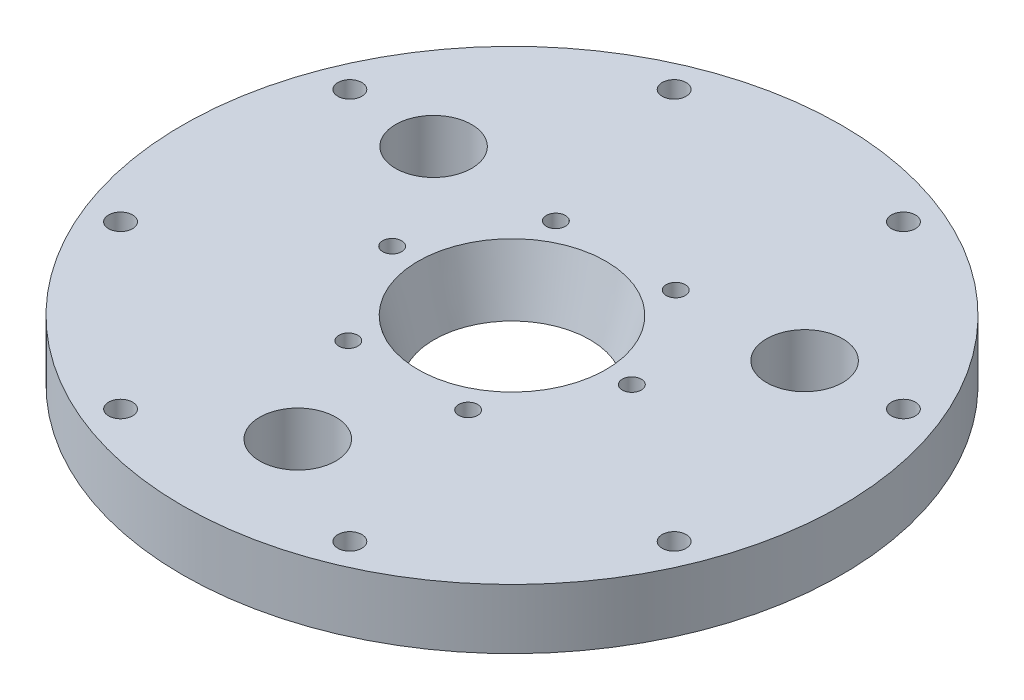
ISO-10303-21;
HEADER;
FILE_DESCRIPTION(('STEP AP214'),'2;1');
FILE_NAME('part.step','',(''),(''),'','','');
FILE_SCHEMA(('AUTOMOTIVE_DESIGN { 1 0 10303 214 1 1 1 1 }'));
ENDSEC;
DATA;
#1=APPLICATION_CONTEXT('core data for automotive mechanical design processes');
#2=APPLICATION_PROTOCOL_DEFINITION('international standard','automotive_design',2000,#1);
#3=PRODUCT_CONTEXT('',#1,'mechanical');
#4=PRODUCT('Part','Part','',(#3));
#5=PRODUCT_RELATED_PRODUCT_CATEGORY('part','',(#4));
#6=PRODUCT_DEFINITION_FORMATION('','',#4);
#7=PRODUCT_DEFINITION_CONTEXT('part definition',#1,'design');
#8=PRODUCT_DEFINITION('design','',#6,#7);
#9=PRODUCT_DEFINITION_SHAPE('','',#8);
#10=(LENGTH_UNIT() NAMED_UNIT(*) SI_UNIT(.MILLI.,.METRE.));
#11=(NAMED_UNIT(*) PLANE_ANGLE_UNIT() SI_UNIT($,.RADIAN.));
#12=(NAMED_UNIT(*) SI_UNIT($,.STERADIAN.) SOLID_ANGLE_UNIT());
#13=UNCERTAINTY_MEASURE_WITH_UNIT(LENGTH_MEASURE(1.E-05),#10,'distance_accuracy_value','');
#14=(GEOMETRIC_REPRESENTATION_CONTEXT(3) GLOBAL_UNCERTAINTY_ASSIGNED_CONTEXT((#13)) GLOBAL_UNIT_ASSIGNED_CONTEXT((#10,
#11,#12)) REPRESENTATION_CONTEXT('',''));
#15=CARTESIAN_POINT('',(0.,0.,0.));
#16=DIRECTION('',(0.,0.,1.));
#17=DIRECTION('',(1.,0.,0.));
#18=AXIS2_PLACEMENT_3D('',#15,#16,#17);
#19=CARTESIAN_POINT('',(0.,10.,0.));
#20=DIRECTION('',(0.,-1.,0.));
#21=DIRECTION('',(0.,0.,-1.));
#22=AXIS2_PLACEMENT_3D('',#19,#20,#21);
#23=CYLINDRICAL_SURFACE('',#22,55.);
#24=CARTESIAN_POINT('',(0.,10.,0.));
#25=DIRECTION('',(0.,1.,0.));
#26=DIRECTION('',(0.,0.,1.));
#27=AXIS2_PLACEMENT_3D('',#24,#25,#26);
#28=CIRCLE('',#27,55.);
#29=CARTESIAN_POINT('',(0.,10.,55.));
#30=VERTEX_POINT('',#29);
#31=EDGE_CURVE('E10',#30,#30,#28,.T.);
#32=ORIENTED_EDGE('',*,*,#31,.F.);
#33=EDGE_LOOP('',(#32));
#34=FACE_BOUND('',#33,.T.);
#35=CARTESIAN_POINT('',(0.,0.,0.));
#36=DIRECTION('',(0.,1.,0.));
#37=DIRECTION('',(0.,0.,1.));
#38=AXIS2_PLACEMENT_3D('',#35,#36,#37);
#39=CIRCLE('',#38,55.);
#40=CARTESIAN_POINT('',(0.,0.,55.));
#41=VERTEX_POINT('',#40);
#42=EDGE_CURVE('E37',#41,#41,#39,.T.);
#43=ORIENTED_EDGE('',*,*,#42,.T.);
#44=EDGE_LOOP('',(#43));
#45=FACE_BOUND('',#44,.T.);
#46=ADVANCED_FACE('F34',(#34,#45),#23,.T.);
#47=CARTESIAN_POINT('',(0.,10.,0.));
#48=DIRECTION('',(0.,1.,0.));
#49=DIRECTION('',(0.,0.,1.));
#50=AXIS2_PLACEMENT_3D('',#47,#48,#49);
#51=PLANE('',#50);
#52=CARTESIAN_POINT('',(10.0000000000002,10.,-17.3205080756887));
#53=DIRECTION('',(0.,1.,0.));
#54=DIRECTION('',(0.866025403784433,0.,0.50000000000001));
#55=AXIS2_PLACEMENT_3D('',#52,#53,#54);
#56=CIRCLE('',#55,1.5875);
#57=CARTESIAN_POINT('',(11.374815328508,10.,-16.5267580756886));
#58=VERTEX_POINT('',#57);
#59=EDGE_CURVE('E130',#58,#58,#56,.T.);
#60=ORIENTED_EDGE('',*,*,#59,.F.);
#61=EDGE_LOOP('',(#60));
#62=FACE_BOUND('',#61,.T.);
#63=CARTESIAN_POINT('',(-9.99999999999984,10.,-17.3205080756889));
#64=DIRECTION('',(0.,1.,0.));
#65=DIRECTION('',(0.866025403784443,0.,-0.499999999999992));
#66=AXIS2_PLACEMENT_3D('',#63,#64,#65);
#67=CIRCLE('',#66,1.5875);
#68=CARTESIAN_POINT('',(-8.62518467149204,10.,-18.1142580756889));
#69=VERTEX_POINT('',#68);
#70=EDGE_CURVE('E136',#69,#69,#67,.T.);
#71=ORIENTED_EDGE('',*,*,#70,.F.);
#72=EDGE_LOOP('',(#71));
#73=FACE_BOUND('',#72,.T.);
#74=CARTESIAN_POINT('',(-20.,10.,0.));
#75=DIRECTION('',(0.,1.,0.));
#76=DIRECTION('',(0.,0.,-1.));
#77=AXIS2_PLACEMENT_3D('',#74,#75,#76);
#78=CIRCLE('',#77,1.5875);
#79=CARTESIAN_POINT('',(-20.,10.,-1.5875));
#80=VERTEX_POINT('',#79);
#81=EDGE_CURVE('E142',#80,#80,#78,.T.);
#82=ORIENTED_EDGE('',*,*,#81,.F.);
#83=EDGE_LOOP('',(#82));
#84=FACE_BOUND('',#83,.T.);
#85=CARTESIAN_POINT('',(-10.0000000000001,10.,17.3205080756887));
#86=DIRECTION('',(0.,1.,0.));
#87=DIRECTION('',(-0.866025403784436,0.,-0.500000000000004));
#88=AXIS2_PLACEMENT_3D('',#85,#86,#87);
#89=CIRCLE('',#88,1.5875);
#90=CARTESIAN_POINT('',(-11.3748153285079,10.,16.5267580756887));
#91=VERTEX_POINT('',#90);
#92=EDGE_CURVE('E148',#91,#91,#89,.T.);
#93=ORIENTED_EDGE('',*,*,#92,.F.);
#94=EDGE_LOOP('',(#93));
#95=FACE_BOUND('',#94,.T.);
#96=CARTESIAN_POINT('',(9.99999999999996,10.,17.3205080756888));
#97=DIRECTION('',(0.,1.,0.));
#98=DIRECTION('',(-0.86602540378444,0.,0.499999999999998));
#99=AXIS2_PLACEMENT_3D('',#96,#97,#98);
#100=CIRCLE('',#99,1.5875);
#101=CARTESIAN_POINT('',(8.62518467149216,10.,18.1142580756888));
#102=VERTEX_POINT('',#101);
#103=EDGE_CURVE('E124',#102,#102,#100,.T.);
#104=ORIENTED_EDGE('',*,*,#103,.F.);
#105=EDGE_LOOP('',(#104));
#106=FACE_BOUND('',#105,.T.);
#107=CARTESIAN_POINT('',(20.,10.,0.));
#108=DIRECTION('',(0.,1.,0.));
#109=DIRECTION('',(0.,0.,1.));
#110=AXIS2_PLACEMENT_3D('',#107,#108,#109);
#111=CIRCLE('',#110,1.5875);
#112=CARTESIAN_POINT('',(20.,10.,1.5875));
#113=VERTEX_POINT('',#112);
#114=EDGE_CURVE('E118',#113,#113,#111,.T.);
#115=ORIENTED_EDGE('',*,*,#114,.F.);
#116=EDGE_LOOP('',(#115));
#117=FACE_BOUND('',#116,.T.);
#118=CARTESIAN_POINT('',(-30.9604081852938,10.,-17.8749999999998));
#119=DIRECTION('',(0.,1.,0.));
#120=DIRECTION('',(0.866025403784436,0.,-0.500000000000004));
#121=AXIS2_PLACEMENT_3D('',#118,#119,#120);
#122=CIRCLE('',#121,6.35);
#123=CARTESIAN_POINT('',(-25.4611468712626,10.,-21.0499999999998));
#124=VERTEX_POINT('',#123);
#125=EDGE_CURVE('E113',#124,#124,#122,.T.);
#126=ORIENTED_EDGE('',*,*,#125,.F.);
#127=EDGE_LOOP('',(#126));
#128=FACE_BOUND('',#127,.T.);
#129=CARTESIAN_POINT('',(3.81639164714898E-13,10.,35.75));
#130=DIRECTION('',(0.,1.,0.));
#131=DIRECTION('',(-0.866025403784443,0.,-0.499999999999992));
#132=AXIS2_PLACEMENT_3D('',#129,#130,#131);
#133=CIRCLE('',#132,6.35);
#134=CARTESIAN_POINT('',(-5.49926131403083,10.,32.575));
#135=VERTEX_POINT('',#134);
#136=EDGE_CURVE('E106',#135,#135,#133,.T.);
#137=ORIENTED_EDGE('',*,*,#136,.F.);
#138=EDGE_LOOP('',(#137));
#139=FACE_BOUND('',#138,.T.);
#140=CARTESIAN_POINT('',(30.9604081852937,10.,-17.875));
#141=DIRECTION('',(0.,1.,0.));
#142=DIRECTION('',(0.,0.,1.));
#143=AXIS2_PLACEMENT_3D('',#140,#141,#142);
#144=CIRCLE('',#143,6.35);
#145=CARTESIAN_POINT('',(30.9604081852937,10.,-11.525));
#146=VERTEX_POINT('',#145);
#147=EDGE_CURVE('E100',#146,#146,#144,.T.);
#148=ORIENTED_EDGE('',*,*,#147,.F.);
#149=EDGE_LOOP('',(#148));
#150=FACE_BOUND('',#149,.T.);
#151=CARTESIAN_POINT('',(46.1939766255646,10.,19.1341716182539));
#152=DIRECTION('',(0.,1.,0.));
#153=DIRECTION('',(-0.707106781186539,0.,0.707106781186556));
#154=AXIS2_PLACEMENT_3D('',#151,#152,#153);
#155=CIRCLE('',#154,2.);
#156=CARTESIAN_POINT('',(44.7797630631915,10.,20.548385180627));
#157=VERTEX_POINT('',#156);
#158=EDGE_CURVE('E67',#157,#157,#155,.T.);
#159=ORIENTED_EDGE('',*,*,#158,.F.);
#160=EDGE_LOOP('',(#159));
#161=FACE_BOUND('',#160,.T.);
#162=CARTESIAN_POINT('',(19.134171618255,10.,46.1939766255641));
#163=DIRECTION('',(0.,1.,0.));
#164=DIRECTION('',(-1.,0.,0.));
#165=AXIS2_PLACEMENT_3D('',#162,#163,#164);
#166=CIRCLE('',#165,2.);
#167=CARTESIAN_POINT('',(17.134171618255,10.,46.1939766255641));
#168=VERTEX_POINT('',#167);
#169=EDGE_CURVE('E74',#168,#168,#166,.T.);
#170=ORIENTED_EDGE('',*,*,#169,.F.);
#171=EDGE_LOOP('',(#170));
#172=FACE_BOUND('',#171,.T.);
#173=CARTESIAN_POINT('',(-19.1341716182541,10.,46.1939766255645));
#174=DIRECTION('',(0.,1.,0.));
#175=DIRECTION('',(-0.707106781186554,0.,-0.707106781186541));
#176=AXIS2_PLACEMENT_3D('',#173,#174,#175);
#177=CIRCLE('',#176,2.);
#178=CARTESIAN_POINT('',(-20.5483851806272,10.,44.7797630631914));
#179=VERTEX_POINT('',#178);
#180=EDGE_CURVE('E80',#179,#179,#177,.T.);
#181=ORIENTED_EDGE('',*,*,#180,.F.);
#182=EDGE_LOOP('',(#181));
#183=FACE_BOUND('',#182,.T.);
#184=CARTESIAN_POINT('',(-46.1939766255643,10.,19.1341716182545));
#185=DIRECTION('',(0.,1.,0.));
#186=DIRECTION('',(0.,0.,-1.));
#187=AXIS2_PLACEMENT_3D('',#184,#185,#186);
#188=CIRCLE('',#187,2.);
#189=CARTESIAN_POINT('',(-46.1939766255643,10.,17.1341716182545));
#190=VERTEX_POINT('',#189);
#191=EDGE_CURVE('E86',#190,#190,#188,.T.);
#192=ORIENTED_EDGE('',*,*,#191,.F.);
#193=EDGE_LOOP('',(#192));
#194=FACE_BOUND('',#193,.T.);
#195=CARTESIAN_POINT('',(-46.1939766255645,10.,-19.1341716182542));
#196=DIRECTION('',(0.,1.,0.));
#197=DIRECTION('',(0.707106781186544,0.,-0.707106781186551));
#198=AXIS2_PLACEMENT_3D('',#195,#196,#197);
#199=CIRCLE('',#198,2.);
#200=CARTESIAN_POINT('',(-44.7797630631914,10.,-20.5483851806273));
#201=VERTEX_POINT('',#200);
#202=EDGE_CURVE('E92',#201,#201,#199,.T.);
#203=ORIENTED_EDGE('',*,*,#202,.F.);
#204=EDGE_LOOP('',(#203));
#205=FACE_BOUND('',#204,.T.);
#206=CARTESIAN_POINT('',(-19.1341716182547,10.,-46.1939766255643));
#207=DIRECTION('',(0.,1.,0.));
#208=DIRECTION('',(1.,0.,0.));
#209=AXIS2_PLACEMENT_3D('',#206,#207,#208);
#210=CIRCLE('',#209,2.);
#211=CARTESIAN_POINT('',(-17.1341716182547,10.,-46.1939766255643));
#212=VERTEX_POINT('',#211);
#213=EDGE_CURVE('E61',#212,#212,#210,.T.);
#214=ORIENTED_EDGE('',*,*,#213,.F.);
#215=EDGE_LOOP('',(#214));
#216=FACE_BOUND('',#215,.T.);
#217=CARTESIAN_POINT('',(19.1341716182544,10.,-46.1939766255644));
#218=DIRECTION('',(0.,1.,0.));
#219=DIRECTION('',(0.707106781186549,0.,0.707106781186546));
#220=AXIS2_PLACEMENT_3D('',#217,#218,#219);
#221=CIRCLE('',#220,2.);
#222=CARTESIAN_POINT('',(20.5483851806275,10.,-44.7797630631913));
#223=VERTEX_POINT('',#222);
#224=EDGE_CURVE('E55',#223,#223,#221,.T.);
#225=ORIENTED_EDGE('',*,*,#224,.F.);
#226=EDGE_LOOP('',(#225));
#227=FACE_BOUND('',#226,.T.);
#228=CARTESIAN_POINT('',(46.1939766255643,10.,-19.1341716182545));
#229=DIRECTION('',(0.,1.,0.));
#230=DIRECTION('',(0.,0.,1.));
#231=AXIS2_PLACEMENT_3D('',#228,#229,#230);
#232=CIRCLE('',#231,2.);
#233=CARTESIAN_POINT('',(46.1939766255643,10.,-17.1341716182545));
#234=VERTEX_POINT('',#233);
#235=EDGE_CURVE('E51',#234,#234,#232,.T.);
#236=ORIENTED_EDGE('',*,*,#235,.F.);
#237=EDGE_LOOP('',(#236));
#238=FACE_BOUND('',#237,.T.);
#239=CARTESIAN_POINT('',(0.,10.,0.));
#240=DIRECTION('',(0.,-1.,0.));
#241=DIRECTION('',(0.,0.,-1.));
#242=AXIS2_PLACEMENT_3D('',#239,#240,#241);
#243=CIRCLE('',#242,15.6794919243112);
#244=CARTESIAN_POINT('',(0.,10.,-15.6794919243112));
#245=VERTEX_POINT('',#244);
#246=EDGE_CURVE('E48',#245,#245,#243,.T.);
#247=ORIENTED_EDGE('',*,*,#246,.T.);
#248=EDGE_LOOP('',(#247));
#249=FACE_BOUND('',#248,.T.);
#250=ORIENTED_EDGE('',*,*,#31,.T.);
#251=EDGE_LOOP('',(#250));
#252=FACE_BOUND('',#251,.T.);
#253=ADVANCED_FACE('F163',(#62,#73,#84,#95,#106,#117,#128,#139,#150,#161,#172,#183,#194,#205,
#216,#227,#238,#249,#252),#51,.T.);
#254=CARTESIAN_POINT('',(0.,0.,0.));
#255=DIRECTION('',(0.,1.,0.));
#256=DIRECTION('',(0.,0.,1.));
#257=AXIS2_PLACEMENT_3D('',#254,#255,#256);
#258=PLANE('',#257);
#259=CARTESIAN_POINT('',(-30.9604081852938,0.,-17.8749999999998));
#260=DIRECTION('',(0.,1.,0.));
#261=DIRECTION('',(0.866025403784436,0.,-0.500000000000004));
#262=AXIS2_PLACEMENT_3D('',#259,#260,#261);
#263=CIRCLE('',#262,6.35);
#264=CARTESIAN_POINT('',(-25.4611468712626,0.,-21.0499999999998));
#265=VERTEX_POINT('',#264);
#266=EDGE_CURVE('E103',#265,#265,#263,.T.);
#267=ORIENTED_EDGE('',*,*,#266,.T.);
#268=EDGE_LOOP('',(#267));
#269=FACE_BOUND('',#268,.T.);
#270=CARTESIAN_POINT('',(3.81639164714898E-13,0.,35.75));
#271=DIRECTION('',(0.,1.,0.));
#272=DIRECTION('',(-0.866025403784443,0.,-0.499999999999992));
#273=AXIS2_PLACEMENT_3D('',#270,#271,#272);
#274=CIRCLE('',#273,6.35);
#275=CARTESIAN_POINT('',(-5.49926131403083,0.,32.575));
#276=VERTEX_POINT('',#275);
#277=EDGE_CURVE('E109',#276,#276,#274,.T.);
#278=ORIENTED_EDGE('',*,*,#277,.T.);
#279=EDGE_LOOP('',(#278));
#280=FACE_BOUND('',#279,.T.);
#281=CARTESIAN_POINT('',(30.9604081852937,0.,-17.875));
#282=DIRECTION('',(0.,1.,0.));
#283=DIRECTION('',(0.,0.,1.));
#284=AXIS2_PLACEMENT_3D('',#281,#282,#283);
#285=CIRCLE('',#284,6.35);
#286=CARTESIAN_POINT('',(30.9604081852937,0.,-11.525));
#287=VERTEX_POINT('',#286);
#288=EDGE_CURVE('E68',#287,#287,#285,.T.);
#289=ORIENTED_EDGE('',*,*,#288,.T.);
#290=EDGE_LOOP('',(#289));
#291=FACE_BOUND('',#290,.T.);
#292=CARTESIAN_POINT('',(46.1939766255646,0.,19.1341716182539));
#293=DIRECTION('',(0.,1.,0.));
#294=DIRECTION('',(-0.707106781186539,0.,0.707106781186556));
#295=AXIS2_PLACEMENT_3D('',#292,#293,#294);
#296=CIRCLE('',#295,2.);
#297=CARTESIAN_POINT('',(44.7797630631915,0.,20.548385180627));
#298=VERTEX_POINT('',#297);
#299=EDGE_CURVE('E64',#298,#298,#296,.T.);
#300=ORIENTED_EDGE('',*,*,#299,.T.);
#301=EDGE_LOOP('',(#300));
#302=FACE_BOUND('',#301,.T.);
#303=CARTESIAN_POINT('',(19.134171618255,0.,46.1939766255641));
#304=DIRECTION('',(0.,1.,0.));
#305=DIRECTION('',(-1.,0.,0.));
#306=AXIS2_PLACEMENT_3D('',#303,#304,#305);
#307=CIRCLE('',#306,2.);
#308=CARTESIAN_POINT('',(17.134171618255,0.,46.1939766255641));
#309=VERTEX_POINT('',#308);
#310=EDGE_CURVE('E71',#309,#309,#307,.T.);
#311=ORIENTED_EDGE('',*,*,#310,.T.);
#312=EDGE_LOOP('',(#311));
#313=FACE_BOUND('',#312,.T.);
#314=CARTESIAN_POINT('',(-19.1341716182541,0.,46.1939766255645));
#315=DIRECTION('',(0.,1.,0.));
#316=DIRECTION('',(-0.707106781186554,0.,-0.707106781186541));
#317=AXIS2_PLACEMENT_3D('',#314,#315,#316);
#318=CIRCLE('',#317,2.);
#319=CARTESIAN_POINT('',(-20.5483851806272,0.,44.7797630631914));
#320=VERTEX_POINT('',#319);
#321=EDGE_CURVE('E77',#320,#320,#318,.T.);
#322=ORIENTED_EDGE('',*,*,#321,.T.);
#323=EDGE_LOOP('',(#322));
#324=FACE_BOUND('',#323,.T.);
#325=CARTESIAN_POINT('',(-46.1939766255643,0.,19.1341716182545));
#326=DIRECTION('',(0.,1.,0.));
#327=DIRECTION('',(0.,0.,-1.));
#328=AXIS2_PLACEMENT_3D('',#325,#326,#327);
#329=CIRCLE('',#328,2.);
#330=CARTESIAN_POINT('',(-46.1939766255643,0.,17.1341716182545));
#331=VERTEX_POINT('',#330);
#332=EDGE_CURVE('E83',#331,#331,#329,.T.);
#333=ORIENTED_EDGE('',*,*,#332,.T.);
#334=EDGE_LOOP('',(#333));
#335=FACE_BOUND('',#334,.T.);
#336=CARTESIAN_POINT('',(-46.1939766255645,0.,-19.1341716182542));
#337=DIRECTION('',(0.,1.,0.));
#338=DIRECTION('',(0.707106781186544,0.,-0.707106781186551));
#339=AXIS2_PLACEMENT_3D('',#336,#337,#338);
#340=CIRCLE('',#339,2.);
#341=CARTESIAN_POINT('',(-44.7797630631914,0.,-20.5483851806273));
#342=VERTEX_POINT('',#341);
#343=EDGE_CURVE('E89',#342,#342,#340,.T.);
#344=ORIENTED_EDGE('',*,*,#343,.T.);
#345=EDGE_LOOP('',(#344));
#346=FACE_BOUND('',#345,.T.);
#347=CARTESIAN_POINT('',(-19.1341716182547,0.,-46.1939766255643));
#348=DIRECTION('',(0.,1.,0.));
#349=DIRECTION('',(1.,0.,0.));
#350=AXIS2_PLACEMENT_3D('',#347,#348,#349);
#351=CIRCLE('',#350,2.);
#352=CARTESIAN_POINT('',(-17.1341716182547,0.,-46.1939766255643));
#353=VERTEX_POINT('',#352);
#354=EDGE_CURVE('E95',#353,#353,#351,.T.);
#355=ORIENTED_EDGE('',*,*,#354,.T.);
#356=EDGE_LOOP('',(#355));
#357=FACE_BOUND('',#356,.T.);
#358=CARTESIAN_POINT('',(19.1341716182544,0.,-46.1939766255644));
#359=DIRECTION('',(0.,1.,0.));
#360=DIRECTION('',(0.707106781186549,0.,0.707106781186546));
#361=AXIS2_PLACEMENT_3D('',#358,#359,#360);
#362=CIRCLE('',#361,2.);
#363=CARTESIAN_POINT('',(20.5483851806275,0.,-44.7797630631913));
#364=VERTEX_POINT('',#363);
#365=EDGE_CURVE('E58',#364,#364,#362,.T.);
#366=ORIENTED_EDGE('',*,*,#365,.T.);
#367=EDGE_LOOP('',(#366));
#368=FACE_BOUND('',#367,.T.);
#369=CARTESIAN_POINT('',(46.1939766255643,0.,-19.1341716182545));
#370=DIRECTION('',(0.,1.,0.));
#371=DIRECTION('',(0.,0.,1.));
#372=AXIS2_PLACEMENT_3D('',#369,#370,#371);
#373=CIRCLE('',#372,2.);
#374=CARTESIAN_POINT('',(46.1939766255643,0.,-17.1341716182545));
#375=VERTEX_POINT('',#374);
#376=EDGE_CURVE('E52',#375,#375,#373,.T.);
#377=ORIENTED_EDGE('',*,*,#376,.T.);
#378=EDGE_LOOP('',(#377));
#379=FACE_BOUND('',#378,.T.);
#380=CARTESIAN_POINT('',(0.,0.,0.));
#381=DIRECTION('',(0.,-1.,0.));
#382=DIRECTION('',(0.,0.,-1.));
#383=AXIS2_PLACEMENT_3D('',#380,#381,#382);
#384=CIRCLE('',#383,13.);
#385=CARTESIAN_POINT('',(0.,0.,-13.));
#386=VERTEX_POINT('',#385);
#387=EDGE_CURVE('E44',#386,#386,#384,.T.);
#388=ORIENTED_EDGE('',*,*,#387,.F.);
#389=EDGE_LOOP('',(#388));
#390=FACE_BOUND('',#389,.T.);
#391=ORIENTED_EDGE('',*,*,#42,.F.);
#392=EDGE_LOOP('',(#391));
#393=FACE_BOUND('',#392,.T.);
#394=ADVANCED_FACE('F166',(#269,#280,#291,#302,#313,#324,#335,#346,#357,#368,#379,#390,#393),
#258,.F.);
#395=CARTESIAN_POINT('',(0.,0.,0.));
#396=DIRECTION('',(0.,1.,0.));
#397=DIRECTION('',(0.,0.,1.));
#398=AXIS2_PLACEMENT_3D('',#395,#396,#397);
#399=CONICAL_SURFACE('',#398,13.,0.26179938779915);
#400=ORIENTED_EDGE('',*,*,#246,.F.);
#401=EDGE_LOOP('',(#400));
#402=FACE_BOUND('',#401,.T.);
#403=ORIENTED_EDGE('',*,*,#387,.T.);
#404=EDGE_LOOP('',(#403));
#405=FACE_BOUND('',#404,.T.);
#406=ADVANCED_FACE('F197',(#402,#405),#399,.F.);
#407=CARTESIAN_POINT('',(46.1939766255643,10.,-19.1341716182545));
#408=DIRECTION('',(0.,-1.,0.));
#409=DIRECTION('',(0.,0.,-1.));
#410=AXIS2_PLACEMENT_3D('',#407,#408,#409);
#411=CYLINDRICAL_SURFACE('',#410,2.);
#412=ORIENTED_EDGE('',*,*,#235,.T.);
#413=EDGE_LOOP('',(#412));
#414=FACE_BOUND('',#413,.T.);
#415=ORIENTED_EDGE('',*,*,#376,.F.);
#416=EDGE_LOOP('',(#415));
#417=FACE_BOUND('',#416,.T.);
#418=ADVANCED_FACE('F200',(#414,#417),#411,.F.);
#419=CARTESIAN_POINT('',(19.1341716182544,10.,-46.1939766255644));
#420=DIRECTION('',(0.,-1.,0.));
#421=DIRECTION('',(0.,0.,-1.));
#422=AXIS2_PLACEMENT_3D('',#419,#420,#421);
#423=CYLINDRICAL_SURFACE('',#422,2.);
#424=ORIENTED_EDGE('',*,*,#224,.T.);
#425=EDGE_LOOP('',(#424));
#426=FACE_BOUND('',#425,.T.);
#427=ORIENTED_EDGE('',*,*,#365,.F.);
#428=EDGE_LOOP('',(#427));
#429=FACE_BOUND('',#428,.T.);
#430=ADVANCED_FACE('F235',(#426,#429),#423,.F.);
#431=CARTESIAN_POINT('',(-19.1341716182547,10.,-46.1939766255643));
#432=DIRECTION('',(0.,-1.,0.));
#433=DIRECTION('',(0.,0.,-1.));
#434=AXIS2_PLACEMENT_3D('',#431,#432,#433);
#435=CYLINDRICAL_SURFACE('',#434,2.);
#436=ORIENTED_EDGE('',*,*,#213,.T.);
#437=EDGE_LOOP('',(#436));
#438=FACE_BOUND('',#437,.T.);
#439=ORIENTED_EDGE('',*,*,#354,.F.);
#440=EDGE_LOOP('',(#439));
#441=FACE_BOUND('',#440,.T.);
#442=ADVANCED_FACE('F243',(#438,#441),#435,.F.);
#443=CARTESIAN_POINT('',(-46.1939766255645,10.,-19.1341716182542));
#444=DIRECTION('',(0.,-1.,0.));
#445=DIRECTION('',(0.,0.,-1.));
#446=AXIS2_PLACEMENT_3D('',#443,#444,#445);
#447=CYLINDRICAL_SURFACE('',#446,2.);
#448=ORIENTED_EDGE('',*,*,#202,.T.);
#449=EDGE_LOOP('',(#448));
#450=FACE_BOUND('',#449,.T.);
#451=ORIENTED_EDGE('',*,*,#343,.F.);
#452=EDGE_LOOP('',(#451));
#453=FACE_BOUND('',#452,.T.);
#454=ADVANCED_FACE('F251',(#450,#453),#447,.F.);
#455=CARTESIAN_POINT('',(-46.1939766255643,10.,19.1341716182545));
#456=DIRECTION('',(0.,-1.,0.));
#457=DIRECTION('',(0.,0.,-1.));
#458=AXIS2_PLACEMENT_3D('',#455,#456,#457);
#459=CYLINDRICAL_SURFACE('',#458,2.);
#460=ORIENTED_EDGE('',*,*,#191,.T.);
#461=EDGE_LOOP('',(#460));
#462=FACE_BOUND('',#461,.T.);
#463=ORIENTED_EDGE('',*,*,#332,.F.);
#464=EDGE_LOOP('',(#463));
#465=FACE_BOUND('',#464,.T.);
#466=ADVANCED_FACE('F259',(#462,#465),#459,.F.);
#467=CARTESIAN_POINT('',(-19.1341716182541,10.,46.1939766255645));
#468=DIRECTION('',(0.,-1.,0.));
#469=DIRECTION('',(0.,0.,-1.));
#470=AXIS2_PLACEMENT_3D('',#467,#468,#469);
#471=CYLINDRICAL_SURFACE('',#470,2.);
#472=ORIENTED_EDGE('',*,*,#180,.T.);
#473=EDGE_LOOP('',(#472));
#474=FACE_BOUND('',#473,.T.);
#475=ORIENTED_EDGE('',*,*,#321,.F.);
#476=EDGE_LOOP('',(#475));
#477=FACE_BOUND('',#476,.T.);
#478=ADVANCED_FACE('F267',(#474,#477),#471,.F.);
#479=CARTESIAN_POINT('',(19.134171618255,10.,46.1939766255641));
#480=DIRECTION('',(0.,-1.,0.));
#481=DIRECTION('',(0.,0.,-1.));
#482=AXIS2_PLACEMENT_3D('',#479,#480,#481);
#483=CYLINDRICAL_SURFACE('',#482,2.);
#484=ORIENTED_EDGE('',*,*,#169,.T.);
#485=EDGE_LOOP('',(#484));
#486=FACE_BOUND('',#485,.T.);
#487=ORIENTED_EDGE('',*,*,#310,.F.);
#488=EDGE_LOOP('',(#487));
#489=FACE_BOUND('',#488,.T.);
#490=ADVANCED_FACE('F275',(#486,#489),#483,.F.);
#491=CARTESIAN_POINT('',(46.1939766255646,10.,19.1341716182539));
#492=DIRECTION('',(0.,-1.,0.));
#493=DIRECTION('',(0.,0.,-1.));
#494=AXIS2_PLACEMENT_3D('',#491,#492,#493);
#495=CYLINDRICAL_SURFACE('',#494,2.);
#496=ORIENTED_EDGE('',*,*,#158,.T.);
#497=EDGE_LOOP('',(#496));
#498=FACE_BOUND('',#497,.T.);
#499=ORIENTED_EDGE('',*,*,#299,.F.);
#500=EDGE_LOOP('',(#499));
#501=FACE_BOUND('',#500,.T.);
#502=ADVANCED_FACE('F283',(#498,#501),#495,.F.);
#503=CARTESIAN_POINT('',(30.9604081852937,0.,-17.875));
#504=DIRECTION('',(0.,1.,0.));
#505=DIRECTION('',(0.,0.,1.));
#506=AXIS2_PLACEMENT_3D('',#503,#504,#505);
#507=CYLINDRICAL_SURFACE('',#506,6.35);
#508=ORIENTED_EDGE('',*,*,#288,.F.);
#509=EDGE_LOOP('',(#508));
#510=FACE_BOUND('',#509,.T.);
#511=ORIENTED_EDGE('',*,*,#147,.T.);
#512=EDGE_LOOP('',(#511));
#513=FACE_BOUND('',#512,.T.);
#514=ADVANCED_FACE('F291',(#510,#513),#507,.F.);
#515=CARTESIAN_POINT('',(3.81639164714898E-13,0.,35.75));
#516=DIRECTION('',(0.,1.,0.));
#517=DIRECTION('',(0.,0.,1.));
#518=AXIS2_PLACEMENT_3D('',#515,#516,#517);
#519=CYLINDRICAL_SURFACE('',#518,6.35);
#520=ORIENTED_EDGE('',*,*,#277,.F.);
#521=EDGE_LOOP('',(#520));
#522=FACE_BOUND('',#521,.T.);
#523=ORIENTED_EDGE('',*,*,#136,.T.);
#524=EDGE_LOOP('',(#523));
#525=FACE_BOUND('',#524,.T.);
#526=ADVANCED_FACE('F298',(#522,#525),#519,.F.);
#527=CARTESIAN_POINT('',(-30.9604081852938,0.,-17.8749999999998));
#528=DIRECTION('',(0.,1.,0.));
#529=DIRECTION('',(0.,0.,1.));
#530=AXIS2_PLACEMENT_3D('',#527,#528,#529);
#531=CYLINDRICAL_SURFACE('',#530,6.35);
#532=ORIENTED_EDGE('',*,*,#266,.F.);
#533=EDGE_LOOP('',(#532));
#534=FACE_BOUND('',#533,.T.);
#535=ORIENTED_EDGE('',*,*,#125,.T.);
#536=EDGE_LOOP('',(#535));
#537=FACE_BOUND('',#536,.T.);
#538=ADVANCED_FACE('F305',(#534,#537),#531,.F.);
#539=CARTESIAN_POINT('',(20.,3.,0.));
#540=DIRECTION('',(0.,1.,0.));
#541=DIRECTION('',(0.,0.,1.));
#542=AXIS2_PLACEMENT_3D('',#539,#540,#541);
#543=CYLINDRICAL_SURFACE('',#542,1.5875);
#544=CARTESIAN_POINT('',(20.,3.,0.));
#545=DIRECTION('',(0.,1.,0.));
#546=DIRECTION('',(0.,0.,1.));
#547=AXIS2_PLACEMENT_3D('',#544,#545,#546);
#548=CIRCLE('',#547,1.5875);
#549=CARTESIAN_POINT('',(20.,3.,1.5875));
#550=VERTEX_POINT('',#549);
#551=EDGE_CURVE('E110',#550,#550,#548,.T.);
#552=ORIENTED_EDGE('',*,*,#551,.F.);
#553=EDGE_LOOP('',(#552));
#554=FACE_BOUND('',#553,.T.);
#555=ORIENTED_EDGE('',*,*,#114,.T.);
#556=EDGE_LOOP('',(#555));
#557=FACE_BOUND('',#556,.T.);
#558=ADVANCED_FACE('F313',(#554,#557),#543,.F.);
#559=CARTESIAN_POINT('',(20.,3.,0.));
#560=DIRECTION('',(0.,1.,0.));
#561=DIRECTION('',(0.,0.,1.));
#562=AXIS2_PLACEMENT_3D('',#559,#560,#561);
#563=PLANE('',#562);
#564=ORIENTED_EDGE('',*,*,#551,.T.);
#565=EDGE_LOOP('',(#564));
#566=FACE_BOUND('',#565,.T.);
#567=ADVANCED_FACE('F321',(#566),#563,.T.);
#568=CARTESIAN_POINT('',(9.99999999999996,3.,17.3205080756888));
#569=DIRECTION('',(0.,1.,0.));
#570=DIRECTION('',(0.,0.,1.));
#571=AXIS2_PLACEMENT_3D('',#568,#569,#570);
#572=CYLINDRICAL_SURFACE('',#571,1.5875);
#573=CARTESIAN_POINT('',(9.99999999999996,3.,17.3205080756888));
#574=DIRECTION('',(0.,1.,0.));
#575=DIRECTION('',(-0.86602540378444,0.,0.499999999999998));
#576=AXIS2_PLACEMENT_3D('',#573,#574,#575);
#577=CIRCLE('',#576,1.5875);
#578=CARTESIAN_POINT('',(8.62518467149216,3.,18.1142580756888));
#579=VERTEX_POINT('',#578);
#580=EDGE_CURVE('E121',#579,#579,#577,.T.);
#581=ORIENTED_EDGE('',*,*,#580,.F.);
#582=EDGE_LOOP('',(#581));
#583=FACE_BOUND('',#582,.T.);
#584=ORIENTED_EDGE('',*,*,#103,.T.);
#585=EDGE_LOOP('',(#584));
#586=FACE_BOUND('',#585,.T.);
#587=ADVANCED_FACE('F328',(#583,#586),#572,.F.);
#588=CARTESIAN_POINT('',(9.99999999999996,3.,17.3205080756888));
#589=DIRECTION('',(0.,1.,0.));
#590=DIRECTION('',(-0.86602540378444,0.,0.499999999999998));
#591=AXIS2_PLACEMENT_3D('',#588,#589,#590);
#592=PLANE('',#591);
#593=ORIENTED_EDGE('',*,*,#580,.T.);
#594=EDGE_LOOP('',(#593));
#595=FACE_BOUND('',#594,.T.);
#596=ADVANCED_FACE('F159',(#595),#592,.T.);
#597=CARTESIAN_POINT('',(-10.0000000000001,3.,17.3205080756887));
#598=DIRECTION('',(0.,1.,0.));
#599=DIRECTION('',(0.,0.,1.));
#600=AXIS2_PLACEMENT_3D('',#597,#598,#599);
#601=CYLINDRICAL_SURFACE('',#600,1.5875);
#602=CARTESIAN_POINT('',(-10.0000000000001,3.,17.3205080756887));
#603=DIRECTION('',(0.,1.,0.));
#604=DIRECTION('',(-0.866025403784436,0.,-0.500000000000004));
#605=AXIS2_PLACEMENT_3D('',#602,#603,#604);
#606=CIRCLE('',#605,1.5875);
#607=CARTESIAN_POINT('',(-11.3748153285079,3.,16.5267580756887));
#608=VERTEX_POINT('',#607);
#609=EDGE_CURVE('E127',#608,#608,#606,.T.);
#610=ORIENTED_EDGE('',*,*,#609,.F.);
#611=EDGE_LOOP('',(#610));
#612=FACE_BOUND('',#611,.T.);
#613=ORIENTED_EDGE('',*,*,#92,.T.);
#614=EDGE_LOOP('',(#613));
#615=FACE_BOUND('',#614,.T.);
#616=ADVANCED_FACE('F156',(#612,#615),#601,.F.);
#617=CARTESIAN_POINT('',(-10.0000000000001,3.,17.3205080756887));
#618=DIRECTION('',(0.,1.,0.));
#619=DIRECTION('',(-0.866025403784436,0.,-0.500000000000004));
#620=AXIS2_PLACEMENT_3D('',#617,#618,#619);
#621=PLANE('',#620);
#622=ORIENTED_EDGE('',*,*,#609,.T.);
#623=EDGE_LOOP('',(#622));
#624=FACE_BOUND('',#623,.T.);
#625=ADVANCED_FACE('F154',(#624),#621,.T.);
#626=CARTESIAN_POINT('',(-20.,3.,0.));
#627=DIRECTION('',(0.,1.,0.));
#628=DIRECTION('',(0.,0.,1.));
#629=AXIS2_PLACEMENT_3D('',#626,#627,#628);
#630=CYLINDRICAL_SURFACE('',#629,1.5875);
#631=CARTESIAN_POINT('',(-20.,3.,0.));
#632=DIRECTION('',(0.,1.,0.));
#633=DIRECTION('',(0.,0.,-1.));
#634=AXIS2_PLACEMENT_3D('',#631,#632,#633);
#635=CIRCLE('',#634,1.5875);
#636=CARTESIAN_POINT('',(-20.,3.,-1.5875));
#637=VERTEX_POINT('',#636);
#638=EDGE_CURVE('E145',#637,#637,#635,.T.);
#639=ORIENTED_EDGE('',*,*,#638,.F.);
#640=EDGE_LOOP('',(#639));
#641=FACE_BOUND('',#640,.T.);
#642=ORIENTED_EDGE('',*,*,#81,.T.);
#643=EDGE_LOOP('',(#642));
#644=FACE_BOUND('',#643,.T.);
#645=ADVANCED_FACE('F353',(#641,#644),#630,.F.);
#646=CARTESIAN_POINT('',(-20.,3.,0.));
#647=DIRECTION('',(0.,1.,0.));
#648=DIRECTION('',(0.,0.,-1.));
#649=AXIS2_PLACEMENT_3D('',#646,#647,#648);
#650=PLANE('',#649);
#651=ORIENTED_EDGE('',*,*,#638,.T.);
#652=EDGE_LOOP('',(#651));
#653=FACE_BOUND('',#652,.T.);
#654=ADVANCED_FACE('F360',(#653),#650,.T.);
#655=CARTESIAN_POINT('',(-9.99999999999984,3.,-17.3205080756889));
#656=DIRECTION('',(0.,1.,0.));
#657=DIRECTION('',(0.,0.,1.));
#658=AXIS2_PLACEMENT_3D('',#655,#656,#657);
#659=CYLINDRICAL_SURFACE('',#658,1.5875);
#660=CARTESIAN_POINT('',(-9.99999999999984,3.,-17.3205080756889));
#661=DIRECTION('',(0.,1.,0.));
#662=DIRECTION('',(0.866025403784443,0.,-0.499999999999992));
#663=AXIS2_PLACEMENT_3D('',#660,#661,#662);
#664=CIRCLE('',#663,1.5875);
#665=CARTESIAN_POINT('',(-8.62518467149204,3.,-18.1142580756889));
#666=VERTEX_POINT('',#665);
#667=EDGE_CURVE('E139',#666,#666,#664,.T.);
#668=ORIENTED_EDGE('',*,*,#667,.F.);
#669=EDGE_LOOP('',(#668));
#670=FACE_BOUND('',#669,.T.);
#671=ORIENTED_EDGE('',*,*,#70,.T.);
#672=EDGE_LOOP('',(#671));
#673=FACE_BOUND('',#672,.T.);
#674=ADVANCED_FACE('F368',(#670,#673),#659,.F.);
#675=CARTESIAN_POINT('',(-9.99999999999984,3.,-17.3205080756889));
#676=DIRECTION('',(0.,1.,0.));
#677=DIRECTION('',(0.866025403784443,0.,-0.499999999999992));
#678=AXIS2_PLACEMENT_3D('',#675,#676,#677);
#679=PLANE('',#678);
#680=ORIENTED_EDGE('',*,*,#667,.T.);
#681=EDGE_LOOP('',(#680));
#682=FACE_BOUND('',#681,.T.);
#683=ADVANCED_FACE('F376',(#682),#679,.T.);
#684=CARTESIAN_POINT('',(10.0000000000002,3.,-17.3205080756887));
#685=DIRECTION('',(0.,1.,0.));
#686=DIRECTION('',(0.,0.,1.));
#687=AXIS2_PLACEMENT_3D('',#684,#685,#686);
#688=CYLINDRICAL_SURFACE('',#687,1.5875);
#689=CARTESIAN_POINT('',(10.0000000000002,3.,-17.3205080756887));
#690=DIRECTION('',(0.,1.,0.));
#691=DIRECTION('',(0.866025403784433,0.,0.50000000000001));
#692=AXIS2_PLACEMENT_3D('',#689,#690,#691);
#693=CIRCLE('',#692,1.5875);
#694=CARTESIAN_POINT('',(11.374815328508,3.,-16.5267580756886));
#695=VERTEX_POINT('',#694);
#696=EDGE_CURVE('E133',#695,#695,#693,.T.);
#697=ORIENTED_EDGE('',*,*,#696,.F.);
#698=EDGE_LOOP('',(#697));
#699=FACE_BOUND('',#698,.T.);
#700=ORIENTED_EDGE('',*,*,#59,.T.);
#701=EDGE_LOOP('',(#700));
#702=FACE_BOUND('',#701,.T.);
#703=ADVANCED_FACE('F384',(#699,#702),#688,.F.);
#704=CARTESIAN_POINT('',(10.0000000000002,3.,-17.3205080756887));
#705=DIRECTION('',(0.,1.,0.));
#706=DIRECTION('',(0.866025403784433,0.,0.50000000000001));
#707=AXIS2_PLACEMENT_3D('',#704,#705,#706);
#708=PLANE('',#707);
#709=ORIENTED_EDGE('',*,*,#696,.T.);
#710=EDGE_LOOP('',(#709));
#711=FACE_BOUND('',#710,.T.);
#712=ADVANCED_FACE('F392',(#711),#708,.T.);
#713=CLOSED_SHELL('',(#46,#253,#394,#406,#418,#430,#442,#454,#466,#478,#490,#502,#514,#526,#538,
#558,#567,#587,#596,#616,#625,#645,#654,#674,#683,#703,#712));
#714=MANIFOLD_SOLID_BREP('B2',#713);
#715=ADVANCED_BREP_SHAPE_REPRESENTATION('',(#18,#714),#14);
#716=SHAPE_DEFINITION_REPRESENTATION(#9,#715);
ENDSEC;
END-ISO-10303-21;
